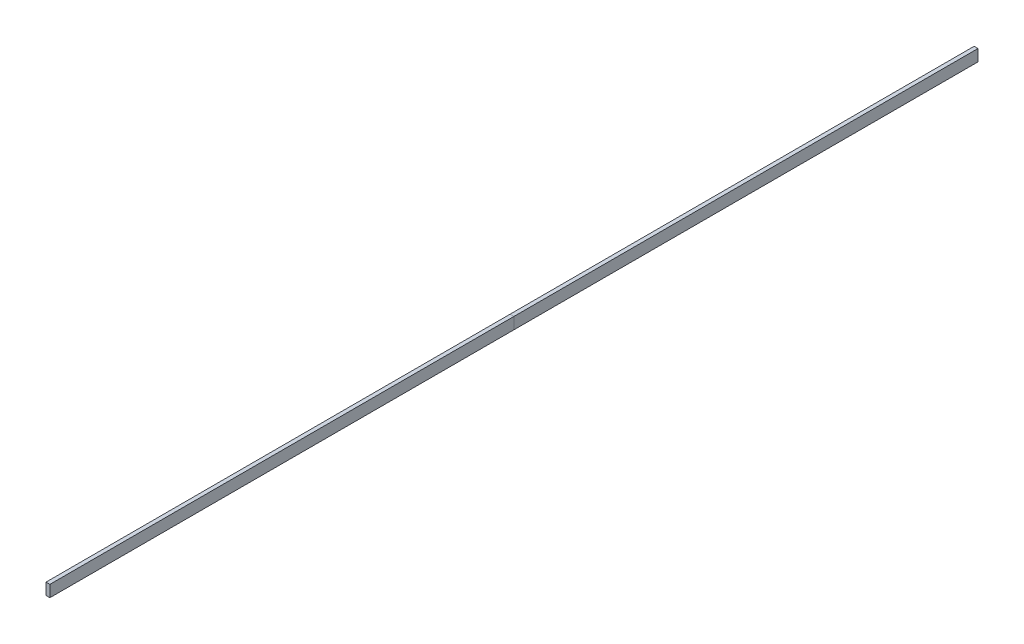
ISO-10303-21;
HEADER;
FILE_DESCRIPTION(('STEP AP214'),'2;1');
FILE_NAME('part.step','',(''),(''),'','','');
FILE_SCHEMA(('AUTOMOTIVE_DESIGN { 1 0 10303 214 1 1 1 1 }'));
ENDSEC;
DATA;
#1=APPLICATION_CONTEXT('core data for automotive mechanical design processes');
#2=APPLICATION_PROTOCOL_DEFINITION('international standard','automotive_design',2000,#1);
#3=PRODUCT_CONTEXT('',#1,'mechanical');
#4=PRODUCT('Part','Part','',(#3));
#5=PRODUCT_RELATED_PRODUCT_CATEGORY('part','',(#4));
#6=PRODUCT_DEFINITION_FORMATION('','',#4);
#7=PRODUCT_DEFINITION_CONTEXT('part definition',#1,'design');
#8=PRODUCT_DEFINITION('design','',#6,#7);
#9=PRODUCT_DEFINITION_SHAPE('','',#8);
#10=(LENGTH_UNIT() NAMED_UNIT(*) SI_UNIT(.MILLI.,.METRE.));
#11=(NAMED_UNIT(*) PLANE_ANGLE_UNIT() SI_UNIT($,.RADIAN.));
#12=(NAMED_UNIT(*) SI_UNIT($,.STERADIAN.) SOLID_ANGLE_UNIT());
#13=UNCERTAINTY_MEASURE_WITH_UNIT(LENGTH_MEASURE(1.E-05),#10,'distance_accuracy_value','');
#14=(GEOMETRIC_REPRESENTATION_CONTEXT(3) GLOBAL_UNCERTAINTY_ASSIGNED_CONTEXT((#13)) GLOBAL_UNIT_ASSIGNED_CONTEXT((#10,
#11,#12)) REPRESENTATION_CONTEXT('',''));
#15=CARTESIAN_POINT('',(0.,0.,0.));
#16=DIRECTION('',(0.,0.,1.));
#17=DIRECTION('',(1.,0.,0.));
#18=AXIS2_PLACEMENT_3D('',#15,#16,#17);
#19=CARTESIAN_POINT('',(-12.7,-38.1,6096.));
#20=DIRECTION('',(0.,1.,0.));
#21=DIRECTION('',(0.,0.,1.));
#22=AXIS2_PLACEMENT_3D('',#19,#20,#21);
#23=PLANE('',#22);
#24=DIRECTION('',(1.,0.,0.));
#25=VECTOR('',#24,1.);
#26=CARTESIAN_POINT('',(-12.7,-38.1,3048.));
#27=LINE('',#26,#25);
#28=CARTESIAN_POINT('',(-12.7,-38.1,3048.));
#29=VERTEX_POINT('',#28);
#30=CARTESIAN_POINT('',(12.7,-38.1,3048.));
#31=VERTEX_POINT('',#30);
#32=EDGE_CURVE('E113',#29,#31,#27,.T.);
#33=ORIENTED_EDGE('',*,*,#32,.T.);
#34=DIRECTION('',(0.,0.,-1.));
#35=VECTOR('',#34,1.);
#36=CARTESIAN_POINT('',(12.7,-38.1,6096.));
#37=LINE('',#36,#35);
#38=CARTESIAN_POINT('',(12.7,-38.1,6096.));
#39=VERTEX_POINT('',#38);
#40=EDGE_CURVE('E12',#39,#31,#37,.T.);
#41=ORIENTED_EDGE('',*,*,#40,.F.);
#42=DIRECTION('',(1.,0.,0.));
#43=VECTOR('',#42,1.);
#44=CARTESIAN_POINT('',(-12.7,-38.1,6096.));
#45=LINE('',#44,#43);
#46=CARTESIAN_POINT('',(-12.7,-38.1,6096.));
#47=VERTEX_POINT('',#46);
#48=EDGE_CURVE('E101',#47,#39,#45,.T.);
#49=ORIENTED_EDGE('',*,*,#48,.F.);
#50=DIRECTION('',(0.,0.,-1.));
#51=VECTOR('',#50,1.);
#52=CARTESIAN_POINT('',(-12.7,-38.1,6096.));
#53=LINE('',#52,#51);
#54=EDGE_CURVE('E109',#47,#29,#53,.T.);
#55=ORIENTED_EDGE('',*,*,#54,.T.);
#56=EDGE_LOOP('',(#33,#41,#49,#55));
#57=FACE_BOUND('',#56,.T.);
#58=ADVANCED_FACE('F50',(#57),#23,.F.);
#59=CARTESIAN_POINT('',(12.7,-38.1,6096.));
#60=DIRECTION('',(-1.,0.,0.));
#61=DIRECTION('',(0.,0.,1.));
#62=AXIS2_PLACEMENT_3D('',#59,#60,#61);
#63=PLANE('',#62);
#64=DIRECTION('',(0.,1.,0.));
#65=VECTOR('',#64,1.);
#66=CARTESIAN_POINT('',(12.7,-38.1,3048.));
#67=LINE('',#66,#65);
#68=CARTESIAN_POINT('',(12.7,38.1,3048.));
#69=VERTEX_POINT('',#68);
#70=EDGE_CURVE('E105',#31,#69,#67,.T.);
#71=ORIENTED_EDGE('',*,*,#70,.T.);
#72=DIRECTION('',(0.,0.,-1.));
#73=VECTOR('',#72,1.);
#74=CARTESIAN_POINT('',(12.7,38.1,6096.));
#75=LINE('',#74,#73);
#76=CARTESIAN_POINT('',(12.7,38.1,6096.));
#77=VERTEX_POINT('',#76);
#78=EDGE_CURVE('E58',#77,#69,#75,.T.);
#79=ORIENTED_EDGE('',*,*,#78,.F.);
#80=DIRECTION('',(0.,1.,0.));
#81=VECTOR('',#80,1.);
#82=CARTESIAN_POINT('',(12.7,-38.1,6096.));
#83=LINE('',#82,#81);
#84=EDGE_CURVE('E96',#39,#77,#83,.T.);
#85=ORIENTED_EDGE('',*,*,#84,.F.);
#86=ORIENTED_EDGE('',*,*,#40,.T.);
#87=EDGE_LOOP('',(#71,#79,#85,#86));
#88=FACE_BOUND('',#87,.T.);
#89=ADVANCED_FACE('F104',(#88),#63,.F.);
#90=CARTESIAN_POINT('',(12.7,38.1,6096.));
#91=DIRECTION('',(0.,-1.,0.));
#92=DIRECTION('',(0.,0.,-1.));
#93=AXIS2_PLACEMENT_3D('',#90,#91,#92);
#94=PLANE('',#93);
#95=DIRECTION('',(-1.,0.,0.));
#96=VECTOR('',#95,1.);
#97=CARTESIAN_POINT('',(12.7,38.1,3048.));
#98=LINE('',#97,#96);
#99=CARTESIAN_POINT('',(-12.7,38.1,3048.));
#100=VERTEX_POINT('',#99);
#101=EDGE_CURVE('E83',#69,#100,#98,.T.);
#102=ORIENTED_EDGE('',*,*,#101,.T.);
#103=DIRECTION('',(0.,0.,-1.));
#104=VECTOR('',#103,1.);
#105=CARTESIAN_POINT('',(-12.7,38.1,6096.));
#106=LINE('',#105,#104);
#107=CARTESIAN_POINT('',(-12.7,38.1,6096.));
#108=VERTEX_POINT('',#107);
#109=EDGE_CURVE('E106',#108,#100,#106,.T.);
#110=ORIENTED_EDGE('',*,*,#109,.F.);
#111=DIRECTION('',(-1.,0.,0.));
#112=VECTOR('',#111,1.);
#113=CARTESIAN_POINT('',(12.7,38.1,6096.));
#114=LINE('',#113,#112);
#115=EDGE_CURVE('E99',#77,#108,#114,.T.);
#116=ORIENTED_EDGE('',*,*,#115,.F.);
#117=ORIENTED_EDGE('',*,*,#78,.T.);
#118=EDGE_LOOP('',(#102,#110,#116,#117));
#119=FACE_BOUND('',#118,.T.);
#120=ADVANCED_FACE('F107',(#119),#94,.F.);
#121=CARTESIAN_POINT('',(-12.7,38.1,6096.));
#122=DIRECTION('',(1.,0.,0.));
#123=DIRECTION('',(0.,0.,-1.));
#124=AXIS2_PLACEMENT_3D('',#121,#122,#123);
#125=PLANE('',#124);
#126=DIRECTION('',(0.,-1.,0.));
#127=VECTOR('',#126,1.);
#128=CARTESIAN_POINT('',(-12.7,38.1,3048.));
#129=LINE('',#128,#127);
#130=EDGE_CURVE('E89',#100,#29,#129,.T.);
#131=ORIENTED_EDGE('',*,*,#130,.T.);
#132=ORIENTED_EDGE('',*,*,#54,.F.);
#133=DIRECTION('',(0.,-1.,0.));
#134=VECTOR('',#133,1.);
#135=CARTESIAN_POINT('',(-12.7,38.1,6096.));
#136=LINE('',#135,#134);
#137=EDGE_CURVE('E66',#108,#47,#136,.T.);
#138=ORIENTED_EDGE('',*,*,#137,.F.);
#139=ORIENTED_EDGE('',*,*,#109,.T.);
#140=EDGE_LOOP('',(#131,#132,#138,#139));
#141=FACE_BOUND('',#140,.T.);
#142=ADVANCED_FACE('F120',(#141),#125,.F.);
#143=CARTESIAN_POINT('',(12.7,-38.1,6096.));
#144=DIRECTION('',(0.,0.,1.));
#145=DIRECTION('',(1.,0.,0.));
#146=AXIS2_PLACEMENT_3D('',#143,#144,#145);
#147=PLANE('',#146);
#148=ORIENTED_EDGE('',*,*,#48,.T.);
#149=ORIENTED_EDGE('',*,*,#84,.T.);
#150=ORIENTED_EDGE('',*,*,#115,.T.);
#151=ORIENTED_EDGE('',*,*,#137,.T.);
#152=EDGE_LOOP('',(#148,#149,#150,#151));
#153=FACE_BOUND('',#152,.T.);
#154=ADVANCED_FACE('F97',(#153),#147,.T.);
#155=CARTESIAN_POINT('',(12.7,-38.1,3048.));
#156=DIRECTION('',(0.,0.,1.));
#157=DIRECTION('',(1.,0.,0.));
#158=AXIS2_PLACEMENT_3D('',#155,#156,#157);
#159=PLANE('',#158);
#160=ORIENTED_EDGE('',*,*,#32,.F.);
#161=ORIENTED_EDGE('',*,*,#130,.F.);
#162=ORIENTED_EDGE('',*,*,#101,.F.);
#163=ORIENTED_EDGE('',*,*,#70,.F.);
#164=EDGE_LOOP('',(#160,#161,#162,#163));
#165=FACE_BOUND('',#164,.T.);
#166=ADVANCED_FACE('F123',(#165),#159,.F.);
#167=CLOSED_SHELL('',(#58,#89,#120,#142,#154,#166));
#168=MANIFOLD_SOLID_BREP('B2',#167);
#169=CARTESIAN_POINT('',(12.7,-38.1,3048.));
#170=DIRECTION('',(-1.,0.,0.));
#171=DIRECTION('',(0.,0.,1.));
#172=AXIS2_PLACEMENT_3D('',#169,#170,#171);
#173=PLANE('',#172);
#174=DIRECTION('',(0.,1.,0.));
#175=VECTOR('',#174,1.);
#176=CARTESIAN_POINT('',(12.7,-38.1,0.));
#177=LINE('',#176,#175);
#178=CARTESIAN_POINT('',(12.7,-38.1,0.));
#179=VERTEX_POINT('',#178);
#180=CARTESIAN_POINT('',(12.7,38.1,0.));
#181=VERTEX_POINT('',#180);
#182=EDGE_CURVE('E236',#179,#181,#177,.T.);
#183=ORIENTED_EDGE('',*,*,#182,.T.);
#184=DIRECTION('',(0.,0.,-1.));
#185=VECTOR('',#184,1.);
#186=CARTESIAN_POINT('',(12.7,38.1,3048.));
#187=LINE('',#186,#185);
#188=CARTESIAN_POINT('',(12.7,38.1,3048.));
#189=VERTEX_POINT('',#188);
#190=EDGE_CURVE('E48',#189,#181,#187,.T.);
#191=ORIENTED_EDGE('',*,*,#190,.F.);
#192=DIRECTION('',(0.,1.,0.));
#193=VECTOR('',#192,1.);
#194=CARTESIAN_POINT('',(12.7,-38.1,3048.));
#195=LINE('',#194,#193);
#196=CARTESIAN_POINT('',(12.7,-38.1,3048.));
#197=VERTEX_POINT('',#196);
#198=EDGE_CURVE('E224',#197,#189,#195,.T.);
#199=ORIENTED_EDGE('',*,*,#198,.F.);
#200=DIRECTION('',(0.,0.,-1.));
#201=VECTOR('',#200,1.);
#202=CARTESIAN_POINT('',(12.7,-38.1,3048.));
#203=LINE('',#202,#201);
#204=EDGE_CURVE('E232',#197,#179,#203,.T.);
#205=ORIENTED_EDGE('',*,*,#204,.T.);
#206=EDGE_LOOP('',(#183,#191,#199,#205));
#207=FACE_BOUND('',#206,.T.);
#208=ADVANCED_FACE('F173',(#207),#173,.F.);
#209=CARTESIAN_POINT('',(-12.7,38.1,3048.));
#210=DIRECTION('',(0.,-1.,0.));
#211=DIRECTION('',(0.,0.,-1.));
#212=AXIS2_PLACEMENT_3D('',#209,#210,#211);
#213=PLANE('',#212);
#214=DIRECTION('',(-1.,0.,0.));
#215=VECTOR('',#214,1.);
#216=CARTESIAN_POINT('',(-12.7,38.1,0.));
#217=LINE('',#216,#215);
#218=CARTESIAN_POINT('',(-12.7,38.1,0.));
#219=VERTEX_POINT('',#218);
#220=EDGE_CURVE('E228',#181,#219,#217,.T.);
#221=ORIENTED_EDGE('',*,*,#220,.T.);
#222=DIRECTION('',(0.,0.,-1.));
#223=VECTOR('',#222,1.);
#224=CARTESIAN_POINT('',(-12.7,38.1,3048.));
#225=LINE('',#224,#223);
#226=CARTESIAN_POINT('',(-12.7,38.1,3048.));
#227=VERTEX_POINT('',#226);
#228=EDGE_CURVE('E181',#227,#219,#225,.T.);
#229=ORIENTED_EDGE('',*,*,#228,.F.);
#230=DIRECTION('',(-1.,0.,0.));
#231=VECTOR('',#230,1.);
#232=CARTESIAN_POINT('',(-12.7,38.1,3048.));
#233=LINE('',#232,#231);
#234=EDGE_CURVE('E219',#189,#227,#233,.T.);
#235=ORIENTED_EDGE('',*,*,#234,.F.);
#236=ORIENTED_EDGE('',*,*,#190,.T.);
#237=EDGE_LOOP('',(#221,#229,#235,#236));
#238=FACE_BOUND('',#237,.T.);
#239=ADVANCED_FACE('F227',(#238),#213,.F.);
#240=CARTESIAN_POINT('',(-12.7,-38.1,3048.));
#241=DIRECTION('',(1.,0.,0.));
#242=DIRECTION('',(0.,0.,-1.));
#243=AXIS2_PLACEMENT_3D('',#240,#241,#242);
#244=PLANE('',#243);
#245=DIRECTION('',(0.,-1.,0.));
#246=VECTOR('',#245,1.);
#247=CARTESIAN_POINT('',(-12.7,-38.1,0.));
#248=LINE('',#247,#246);
#249=CARTESIAN_POINT('',(-12.7,-38.1,0.));
#250=VERTEX_POINT('',#249);
#251=EDGE_CURVE('E206',#219,#250,#248,.T.);
#252=ORIENTED_EDGE('',*,*,#251,.T.);
#253=DIRECTION('',(0.,0.,-1.));
#254=VECTOR('',#253,1.);
#255=CARTESIAN_POINT('',(-12.7,-38.1,3048.));
#256=LINE('',#255,#254);
#257=CARTESIAN_POINT('',(-12.7,-38.1,3048.));
#258=VERTEX_POINT('',#257);
#259=EDGE_CURVE('E229',#258,#250,#256,.T.);
#260=ORIENTED_EDGE('',*,*,#259,.F.);
#261=DIRECTION('',(0.,-1.,0.));
#262=VECTOR('',#261,1.);
#263=CARTESIAN_POINT('',(-12.7,-38.1,3048.));
#264=LINE('',#263,#262);
#265=EDGE_CURVE('E222',#227,#258,#264,.T.);
#266=ORIENTED_EDGE('',*,*,#265,.F.);
#267=ORIENTED_EDGE('',*,*,#228,.T.);
#268=EDGE_LOOP('',(#252,#260,#266,#267));
#269=FACE_BOUND('',#268,.T.);
#270=ADVANCED_FACE('F230',(#269),#244,.F.);
#271=CARTESIAN_POINT('',(-12.7,-38.1,3048.));
#272=DIRECTION('',(0.,1.,0.));
#273=DIRECTION('',(0.,0.,1.));
#274=AXIS2_PLACEMENT_3D('',#271,#272,#273);
#275=PLANE('',#274);
#276=DIRECTION('',(1.,0.,0.));
#277=VECTOR('',#276,1.);
#278=CARTESIAN_POINT('',(-12.7,-38.1,0.));
#279=LINE('',#278,#277);
#280=EDGE_CURVE('E212',#250,#179,#279,.T.);
#281=ORIENTED_EDGE('',*,*,#280,.T.);
#282=ORIENTED_EDGE('',*,*,#204,.F.);
#283=DIRECTION('',(1.,0.,0.));
#284=VECTOR('',#283,1.);
#285=CARTESIAN_POINT('',(-12.7,-38.1,3048.));
#286=LINE('',#285,#284);
#287=EDGE_CURVE('E189',#258,#197,#286,.T.);
#288=ORIENTED_EDGE('',*,*,#287,.F.);
#289=ORIENTED_EDGE('',*,*,#259,.T.);
#290=EDGE_LOOP('',(#281,#282,#288,#289));
#291=FACE_BOUND('',#290,.T.);
#292=ADVANCED_FACE('F243',(#291),#275,.F.);
#293=CARTESIAN_POINT('',(12.7,38.1,3048.));
#294=DIRECTION('',(0.,0.,-1.));
#295=DIRECTION('',(-1.,0.,0.));
#296=AXIS2_PLACEMENT_3D('',#293,#294,#295);
#297=PLANE('',#296);
#298=ORIENTED_EDGE('',*,*,#198,.T.);
#299=ORIENTED_EDGE('',*,*,#234,.T.);
#300=ORIENTED_EDGE('',*,*,#265,.T.);
#301=ORIENTED_EDGE('',*,*,#287,.T.);
#302=EDGE_LOOP('',(#298,#299,#300,#301));
#303=FACE_BOUND('',#302,.T.);
#304=ADVANCED_FACE('F220',(#303),#297,.F.);
#305=CARTESIAN_POINT('',(12.7,38.1,0.));
#306=DIRECTION('',(0.,0.,-1.));
#307=DIRECTION('',(-1.,0.,0.));
#308=AXIS2_PLACEMENT_3D('',#305,#306,#307);
#309=PLANE('',#308);
#310=ORIENTED_EDGE('',*,*,#182,.F.);
#311=ORIENTED_EDGE('',*,*,#280,.F.);
#312=ORIENTED_EDGE('',*,*,#251,.F.);
#313=ORIENTED_EDGE('',*,*,#220,.F.);
#314=EDGE_LOOP('',(#310,#311,#312,#313));
#315=FACE_BOUND('',#314,.T.);
#316=ADVANCED_FACE('F246',(#315),#309,.T.);
#317=CLOSED_SHELL('',(#208,#239,#270,#292,#304,#316));
#318=MANIFOLD_SOLID_BREP('B6',#317);
#319=ADVANCED_BREP_SHAPE_REPRESENTATION('',(#18,#168,#318),#14);
#320=SHAPE_DEFINITION_REPRESENTATION(#9,#319);
ENDSEC;
END-ISO-10303-21;
